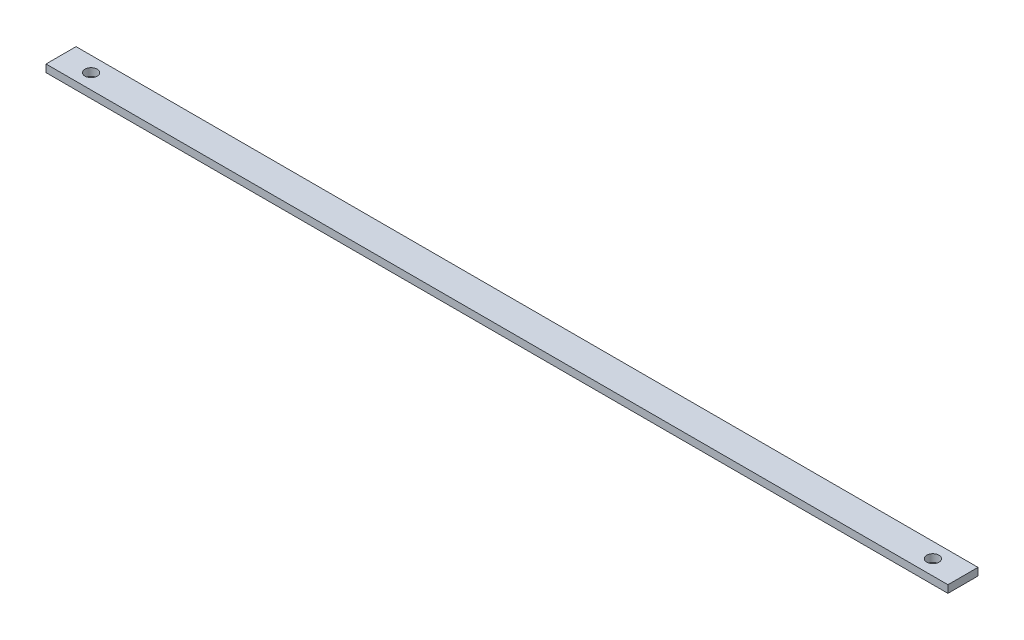
ISO-10303-21;
HEADER;
FILE_DESCRIPTION(('STEP AP214'),'2;1');
FILE_NAME('part.step','',(''),(''),'','','');
FILE_SCHEMA(('AUTOMOTIVE_DESIGN { 1 0 10303 214 1 1 1 1 }'));
ENDSEC;
DATA;
#1=APPLICATION_CONTEXT('core data for automotive mechanical design processes');
#2=APPLICATION_PROTOCOL_DEFINITION('international standard','automotive_design',2000,#1);
#3=PRODUCT_CONTEXT('',#1,'mechanical');
#4=PRODUCT('Part','Part','',(#3));
#5=PRODUCT_RELATED_PRODUCT_CATEGORY('part','',(#4));
#6=PRODUCT_DEFINITION_FORMATION('','',#4);
#7=PRODUCT_DEFINITION_CONTEXT('part definition',#1,'design');
#8=PRODUCT_DEFINITION('design','',#6,#7);
#9=PRODUCT_DEFINITION_SHAPE('','',#8);
#10=(LENGTH_UNIT() NAMED_UNIT(*) SI_UNIT(.MILLI.,.METRE.));
#11=(NAMED_UNIT(*) PLANE_ANGLE_UNIT() SI_UNIT($,.RADIAN.));
#12=(NAMED_UNIT(*) SI_UNIT($,.STERADIAN.) SOLID_ANGLE_UNIT());
#13=UNCERTAINTY_MEASURE_WITH_UNIT(LENGTH_MEASURE(1.E-05),#10,'distance_accuracy_value','');
#14=(GEOMETRIC_REPRESENTATION_CONTEXT(3) GLOBAL_UNCERTAINTY_ASSIGNED_CONTEXT((#13)) GLOBAL_UNIT_ASSIGNED_CONTEXT((#10,
#11,#12)) REPRESENTATION_CONTEXT('',''));
#15=CARTESIAN_POINT('',(0.,0.,0.));
#16=DIRECTION('',(0.,0.,1.));
#17=DIRECTION('',(1.,0.,0.));
#18=AXIS2_PLACEMENT_3D('',#15,#16,#17);
#19=CARTESIAN_POINT('',(381.,6.35,-12.7));
#20=DIRECTION('',(-1.,0.,0.));
#21=DIRECTION('',(0.,0.,1.));
#22=AXIS2_PLACEMENT_3D('',#19,#20,#21);
#23=PLANE('',#22);
#24=DIRECTION('',(0.,0.,-1.));
#25=VECTOR('',#24,1.);
#26=CARTESIAN_POINT('',(381.,0.,-12.7));
#27=LINE('',#26,#25);
#28=CARTESIAN_POINT('',(381.,0.,12.7));
#29=VERTEX_POINT('',#28);
#30=CARTESIAN_POINT('',(381.,0.,-12.7));
#31=VERTEX_POINT('',#30);
#32=EDGE_CURVE('E113',#29,#31,#27,.T.);
#33=ORIENTED_EDGE('',*,*,#32,.T.);
#34=DIRECTION('',(0.,-1.,0.));
#35=VECTOR('',#34,1.);
#36=CARTESIAN_POINT('',(381.,6.35,-12.7));
#37=LINE('',#36,#35);
#38=CARTESIAN_POINT('',(381.,6.35,-12.7));
#39=VERTEX_POINT('',#38);
#40=EDGE_CURVE('E11',#39,#31,#37,.T.);
#41=ORIENTED_EDGE('',*,*,#40,.F.);
#42=DIRECTION('',(0.,0.,-1.));
#43=VECTOR('',#42,1.);
#44=CARTESIAN_POINT('',(381.,6.35,-12.7));
#45=LINE('',#44,#43);
#46=CARTESIAN_POINT('',(381.,6.35,12.7));
#47=VERTEX_POINT('',#46);
#48=EDGE_CURVE('E97',#47,#39,#45,.T.);
#49=ORIENTED_EDGE('',*,*,#48,.F.);
#50=DIRECTION('',(0.,-1.,0.));
#51=VECTOR('',#50,1.);
#52=CARTESIAN_POINT('',(381.,6.35,12.7));
#53=LINE('',#52,#51);
#54=EDGE_CURVE('E109',#47,#29,#53,.T.);
#55=ORIENTED_EDGE('',*,*,#54,.T.);
#56=EDGE_LOOP('',(#33,#41,#49,#55));
#57=FACE_BOUND('',#56,.T.);
#58=ADVANCED_FACE('F45',(#57),#23,.F.);
#59=CARTESIAN_POINT('',(-381.,6.35,-12.7));
#60=DIRECTION('',(0.,0.,1.));
#61=DIRECTION('',(1.,0.,0.));
#62=AXIS2_PLACEMENT_3D('',#59,#60,#61);
#63=PLANE('',#62);
#64=DIRECTION('',(-1.,0.,0.));
#65=VECTOR('',#64,1.);
#66=CARTESIAN_POINT('',(-381.,0.,-12.7));
#67=LINE('',#66,#65);
#68=CARTESIAN_POINT('',(-381.,0.,-12.7));
#69=VERTEX_POINT('',#68);
#70=EDGE_CURVE('E102',#31,#69,#67,.T.);
#71=ORIENTED_EDGE('',*,*,#70,.T.);
#72=DIRECTION('',(0.,-1.,0.));
#73=VECTOR('',#72,1.);
#74=CARTESIAN_POINT('',(-381.,6.35,-12.7));
#75=LINE('',#74,#73);
#76=CARTESIAN_POINT('',(-381.,6.35,-12.7));
#77=VERTEX_POINT('',#76);
#78=EDGE_CURVE('E54',#77,#69,#75,.T.);
#79=ORIENTED_EDGE('',*,*,#78,.F.);
#80=DIRECTION('',(-1.,0.,0.));
#81=VECTOR('',#80,1.);
#82=CARTESIAN_POINT('',(-381.,6.35,-12.7));
#83=LINE('',#82,#81);
#84=EDGE_CURVE('E92',#39,#77,#83,.T.);
#85=ORIENTED_EDGE('',*,*,#84,.F.);
#86=ORIENTED_EDGE('',*,*,#40,.T.);
#87=EDGE_LOOP('',(#71,#79,#85,#86));
#88=FACE_BOUND('',#87,.T.);
#89=ADVANCED_FACE('F101',(#88),#63,.F.);
#90=CARTESIAN_POINT('',(-381.,6.35,-12.7));
#91=DIRECTION('',(1.,0.,0.));
#92=DIRECTION('',(0.,0.,-1.));
#93=AXIS2_PLACEMENT_3D('',#90,#91,#92);
#94=PLANE('',#93);
#95=DIRECTION('',(0.,0.,1.));
#96=VECTOR('',#95,1.);
#97=CARTESIAN_POINT('',(-381.,0.,-12.7));
#98=LINE('',#97,#96);
#99=CARTESIAN_POINT('',(-381.,0.,12.7));
#100=VERTEX_POINT('',#99);
#101=EDGE_CURVE('E79',#69,#100,#98,.T.);
#102=ORIENTED_EDGE('',*,*,#101,.T.);
#103=DIRECTION('',(0.,-1.,0.));
#104=VECTOR('',#103,1.);
#105=CARTESIAN_POINT('',(-381.,6.35,12.7));
#106=LINE('',#105,#104);
#107=CARTESIAN_POINT('',(-381.,6.35,12.7));
#108=VERTEX_POINT('',#107);
#109=EDGE_CURVE('E104',#108,#100,#106,.T.);
#110=ORIENTED_EDGE('',*,*,#109,.F.);
#111=DIRECTION('',(0.,0.,1.));
#112=VECTOR('',#111,1.);
#113=CARTESIAN_POINT('',(-381.,6.35,-12.7));
#114=LINE('',#113,#112);
#115=EDGE_CURVE('E95',#77,#108,#114,.T.);
#116=ORIENTED_EDGE('',*,*,#115,.F.);
#117=ORIENTED_EDGE('',*,*,#78,.T.);
#118=EDGE_LOOP('',(#102,#110,#116,#117));
#119=FACE_BOUND('',#118,.T.);
#120=ADVANCED_FACE('F105',(#119),#94,.F.);
#121=CARTESIAN_POINT('',(-381.,6.35,12.7));
#122=DIRECTION('',(0.,0.,-1.));
#123=DIRECTION('',(-1.,0.,0.));
#124=AXIS2_PLACEMENT_3D('',#121,#122,#123);
#125=PLANE('',#124);
#126=DIRECTION('',(1.,0.,0.));
#127=VECTOR('',#126,1.);
#128=CARTESIAN_POINT('',(-381.,0.,12.7));
#129=LINE('',#128,#127);
#130=EDGE_CURVE('E85',#100,#29,#129,.T.);
#131=ORIENTED_EDGE('',*,*,#130,.T.);
#132=ORIENTED_EDGE('',*,*,#54,.F.);
#133=DIRECTION('',(1.,0.,0.));
#134=VECTOR('',#133,1.);
#135=CARTESIAN_POINT('',(-381.,6.35,12.7));
#136=LINE('',#135,#134);
#137=EDGE_CURVE('E62',#108,#47,#136,.T.);
#138=ORIENTED_EDGE('',*,*,#137,.F.);
#139=ORIENTED_EDGE('',*,*,#109,.T.);
#140=EDGE_LOOP('',(#131,#132,#138,#139));
#141=FACE_BOUND('',#140,.T.);
#142=ADVANCED_FACE('F127',(#141),#125,.F.);
#143=CARTESIAN_POINT('',(0.,6.35,0.));
#144=DIRECTION('',(0.,1.,0.));
#145=DIRECTION('',(0.,0.,1.));
#146=AXIS2_PLACEMENT_3D('',#143,#144,#145);
#147=PLANE('',#146);
#148=CARTESIAN_POINT('',(355.6,6.35,0.));
#149=DIRECTION('',(0.,1.,0.));
#150=DIRECTION('',(0.,0.,1.));
#151=AXIS2_PLACEMENT_3D('',#148,#149,#150);
#152=CIRCLE('',#151,5.15937500000002);
#153=CARTESIAN_POINT('',(355.6,6.35,5.15937500000002));
#154=VERTEX_POINT('',#153);
#155=EDGE_CURVE('E142',#154,#154,#152,.T.);
#156=ORIENTED_EDGE('',*,*,#155,.F.);
#157=EDGE_LOOP('',(#156));
#158=FACE_BOUND('',#157,.T.);
#159=CARTESIAN_POINT('',(-355.6,6.35,0.));
#160=DIRECTION('',(0.,1.,0.));
#161=DIRECTION('',(0.,0.,-1.));
#162=AXIS2_PLACEMENT_3D('',#159,#160,#161);
#163=CIRCLE('',#162,5.15937500000002);
#164=CARTESIAN_POINT('',(-355.6,6.35,-5.15937500000002));
#165=VERTEX_POINT('',#164);
#166=EDGE_CURVE('E138',#165,#165,#163,.T.);
#167=ORIENTED_EDGE('',*,*,#166,.F.);
#168=EDGE_LOOP('',(#167));
#169=FACE_BOUND('',#168,.T.);
#170=ORIENTED_EDGE('',*,*,#48,.T.);
#171=ORIENTED_EDGE('',*,*,#84,.T.);
#172=ORIENTED_EDGE('',*,*,#115,.T.);
#173=ORIENTED_EDGE('',*,*,#137,.T.);
#174=EDGE_LOOP('',(#170,#171,#172,#173));
#175=FACE_BOUND('',#174,.T.);
#176=ADVANCED_FACE('F93',(#158,#169,#175),#147,.T.);
#177=CARTESIAN_POINT('',(0.,0.,0.));
#178=DIRECTION('',(0.,1.,0.));
#179=DIRECTION('',(0.,0.,1.));
#180=AXIS2_PLACEMENT_3D('',#177,#178,#179);
#181=PLANE('',#180);
#182=CARTESIAN_POINT('',(355.6,0.,0.));
#183=DIRECTION('',(0.,1.,0.));
#184=DIRECTION('',(0.,0.,1.));
#185=AXIS2_PLACEMENT_3D('',#182,#183,#184);
#186=CIRCLE('',#185,5.15937500000002);
#187=CARTESIAN_POINT('',(355.6,0.,5.15937500000002));
#188=VERTEX_POINT('',#187);
#189=EDGE_CURVE('E117',#188,#188,#186,.T.);
#190=ORIENTED_EDGE('',*,*,#189,.T.);
#191=EDGE_LOOP('',(#190));
#192=FACE_BOUND('',#191,.T.);
#193=CARTESIAN_POINT('',(-355.6,0.,0.));
#194=DIRECTION('',(0.,1.,0.));
#195=DIRECTION('',(0.,0.,-1.));
#196=AXIS2_PLACEMENT_3D('',#193,#194,#195);
#197=CIRCLE('',#196,5.15937500000002);
#198=CARTESIAN_POINT('',(-355.6,0.,-5.15937500000002));
#199=VERTEX_POINT('',#198);
#200=EDGE_CURVE('E134',#199,#199,#197,.T.);
#201=ORIENTED_EDGE('',*,*,#200,.T.);
#202=EDGE_LOOP('',(#201));
#203=FACE_BOUND('',#202,.T.);
#204=ORIENTED_EDGE('',*,*,#32,.F.);
#205=ORIENTED_EDGE('',*,*,#130,.F.);
#206=ORIENTED_EDGE('',*,*,#101,.F.);
#207=ORIENTED_EDGE('',*,*,#70,.F.);
#208=EDGE_LOOP('',(#204,#205,#206,#207));
#209=FACE_BOUND('',#208,.T.);
#210=ADVANCED_FACE('F130',(#192,#203,#209),#181,.F.);
#211=CARTESIAN_POINT('',(-355.6,0.,0.));
#212=DIRECTION('',(0.,1.,0.));
#213=DIRECTION('',(0.,0.,1.));
#214=AXIS2_PLACEMENT_3D('',#211,#212,#213);
#215=CYLINDRICAL_SURFACE('',#214,5.15937500000002);
#216=ORIENTED_EDGE('',*,*,#200,.F.);
#217=EDGE_LOOP('',(#216));
#218=FACE_BOUND('',#217,.T.);
#219=ORIENTED_EDGE('',*,*,#166,.T.);
#220=EDGE_LOOP('',(#219));
#221=FACE_BOUND('',#220,.T.);
#222=ADVANCED_FACE('F155',(#218,#221),#215,.F.);
#223=CARTESIAN_POINT('',(355.6,0.,0.));
#224=DIRECTION('',(0.,1.,0.));
#225=DIRECTION('',(0.,0.,1.));
#226=AXIS2_PLACEMENT_3D('',#223,#224,#225);
#227=CYLINDRICAL_SURFACE('',#226,5.15937500000002);
#228=ORIENTED_EDGE('',*,*,#189,.F.);
#229=EDGE_LOOP('',(#228));
#230=FACE_BOUND('',#229,.T.);
#231=ORIENTED_EDGE('',*,*,#155,.T.);
#232=EDGE_LOOP('',(#231));
#233=FACE_BOUND('',#232,.T.);
#234=ADVANCED_FACE('F152',(#230,#233),#227,.F.);
#235=CLOSED_SHELL('',(#58,#89,#120,#142,#176,#210,#222,#234));
#236=MANIFOLD_SOLID_BREP('B2',#235);
#237=ADVANCED_BREP_SHAPE_REPRESENTATION('',(#18,#236),#14);
#238=SHAPE_DEFINITION_REPRESENTATION(#9,#237);
ENDSEC;
END-ISO-10303-21;
